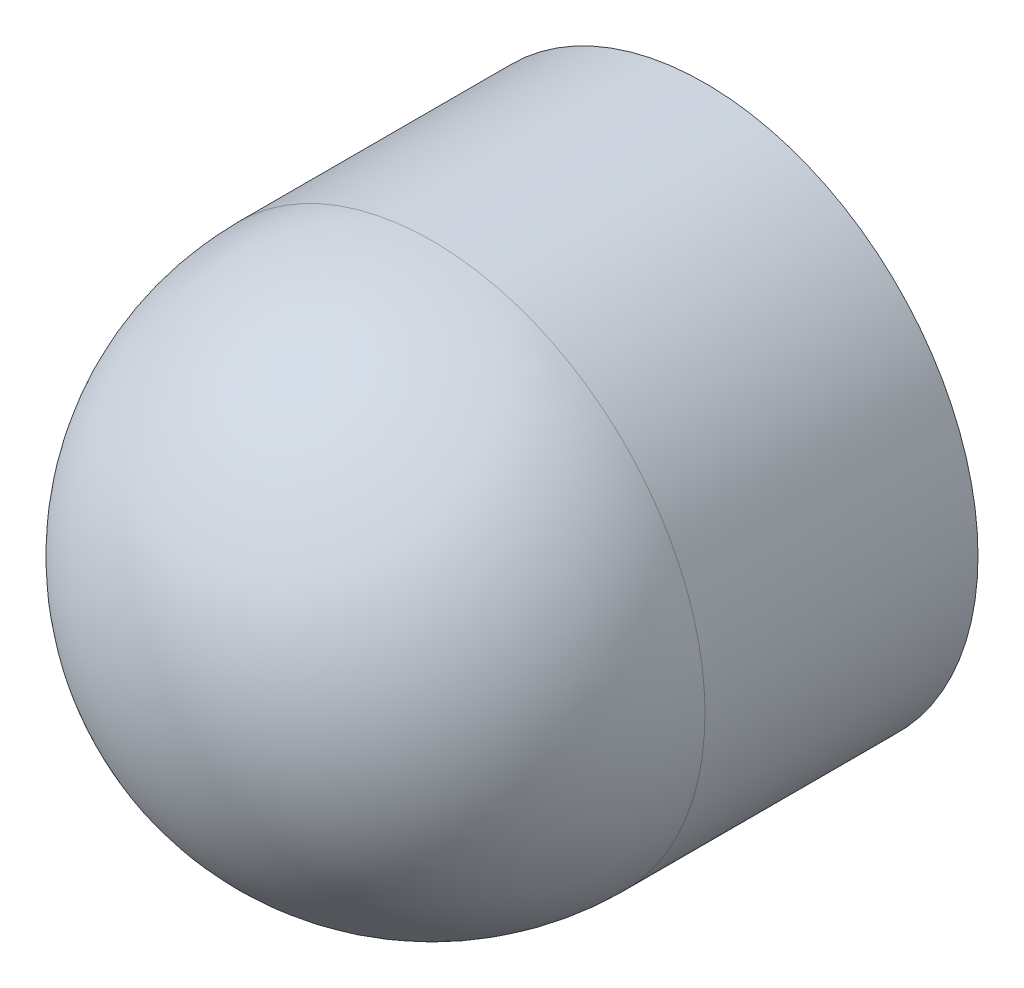
ISO-10303-21;
HEADER;
FILE_DESCRIPTION(('STEP AP214'),'2;1');
FILE_NAME('part.step','',(''),(''),'','','');
FILE_SCHEMA(('AUTOMOTIVE_DESIGN { 1 0 10303 214 1 1 1 1 }'));
ENDSEC;
DATA;
#1=APPLICATION_CONTEXT('core data for automotive mechanical design processes');
#2=APPLICATION_PROTOCOL_DEFINITION('international standard','automotive_design',2000,#1);
#3=PRODUCT_CONTEXT('',#1,'mechanical');
#4=PRODUCT('Part','Part','',(#3));
#5=PRODUCT_RELATED_PRODUCT_CATEGORY('part','',(#4));
#6=PRODUCT_DEFINITION_FORMATION('','',#4);
#7=PRODUCT_DEFINITION_CONTEXT('part definition',#1,'design');
#8=PRODUCT_DEFINITION('design','',#6,#7);
#9=PRODUCT_DEFINITION_SHAPE('','',#8);
#10=(LENGTH_UNIT() NAMED_UNIT(*) SI_UNIT(.MILLI.,.METRE.));
#11=(NAMED_UNIT(*) PLANE_ANGLE_UNIT() SI_UNIT($,.RADIAN.));
#12=(NAMED_UNIT(*) SI_UNIT($,.STERADIAN.) SOLID_ANGLE_UNIT());
#13=UNCERTAINTY_MEASURE_WITH_UNIT(LENGTH_MEASURE(1.E-05),#10,'distance_accuracy_value','');
#14=(GEOMETRIC_REPRESENTATION_CONTEXT(3) GLOBAL_UNCERTAINTY_ASSIGNED_CONTEXT((#13)) GLOBAL_UNIT_ASSIGNED_CONTEXT((#10,
#11,#12)) REPRESENTATION_CONTEXT('',''));
#15=CARTESIAN_POINT('',(0.,0.,0.));
#16=DIRECTION('',(0.,0.,1.));
#17=DIRECTION('',(1.,0.,0.));
#18=AXIS2_PLACEMENT_3D('',#15,#16,#17);
#19=CARTESIAN_POINT('',(0.,0.,10.));
#20=DIRECTION('',(0.,0.,-1.));
#21=DIRECTION('',(-1.,0.,0.));
#22=AXIS2_PLACEMENT_3D('',#19,#20,#21);
#23=CYLINDRICAL_SURFACE('',#22,10.);
#24=CARTESIAN_POINT('',(0.,0.,10.));
#25=DIRECTION('',(0.,0.,1.));
#26=DIRECTION('',(1.,0.,0.));
#27=AXIS2_PLACEMENT_3D('',#24,#25,#26);
#28=CIRCLE('',#27,10.);
#29=CARTESIAN_POINT('',(10.,0.,10.));
#30=VERTEX_POINT('',#29);
#31=EDGE_CURVE('E10',#30,#30,#28,.T.);
#32=ORIENTED_EDGE('',*,*,#31,.F.);
#33=EDGE_LOOP('',(#32));
#34=FACE_BOUND('',#33,.T.);
#35=CARTESIAN_POINT('',(0.,0.,0.));
#36=DIRECTION('',(0.,0.,1.));
#37=DIRECTION('',(1.,0.,0.));
#38=AXIS2_PLACEMENT_3D('',#35,#36,#37);
#39=CIRCLE('',#38,10.);
#40=CARTESIAN_POINT('',(10.,0.,0.));
#41=VERTEX_POINT('',#40);
#42=EDGE_CURVE('E37',#41,#41,#39,.T.);
#43=ORIENTED_EDGE('',*,*,#42,.T.);
#44=EDGE_LOOP('',(#43));
#45=FACE_BOUND('',#44,.T.);
#46=ADVANCED_FACE('F30',(#34,#45),#23,.T.);
#47=CARTESIAN_POINT('',(0.,0.,10.));
#48=DIRECTION('',(0.,0.,1.));
#49=DIRECTION('',(1.,0.,0.));
#50=AXIS2_PLACEMENT_3D('',#47,#48,#49);
#51=SPHERICAL_SURFACE('',#50,10.);
#52=ORIENTED_EDGE('',*,*,#31,.T.);
#53=EDGE_LOOP('',(#52));
#54=FACE_BOUND('',#53,.T.);
#55=ADVANCED_FACE('F32',(#54),#51,.T.);
#56=CARTESIAN_POINT('',(0.,0.,0.));
#57=DIRECTION('',(0.,0.,1.));
#58=DIRECTION('',(1.,0.,0.));
#59=AXIS2_PLACEMENT_3D('',#56,#57,#58);
#60=PLANE('',#59);
#61=CARTESIAN_POINT('',(0.,0.,0.));
#62=DIRECTION('',(0.,0.,-1.));
#63=DIRECTION('',(-1.,0.,0.));
#64=AXIS2_PLACEMENT_3D('',#61,#62,#63);
#65=CIRCLE('',#64,2.52);
#66=CARTESIAN_POINT('',(-2.52,0.,0.));
#67=VERTEX_POINT('',#66);
#68=EDGE_CURVE('E45',#67,#67,#65,.T.);
#69=ORIENTED_EDGE('',*,*,#68,.F.);
#70=EDGE_LOOP('',(#69));
#71=FACE_BOUND('',#70,.T.);
#72=ORIENTED_EDGE('',*,*,#42,.F.);
#73=EDGE_LOOP('',(#72));
#74=FACE_BOUND('',#73,.T.);
#75=ADVANCED_FACE('F53',(#71,#74),#60,.F.);
#76=CARTESIAN_POINT('',(0.,0.,10.));
#77=DIRECTION('',(0.,0.,-1.));
#78=DIRECTION('',(-1.,0.,0.));
#79=AXIS2_PLACEMENT_3D('',#76,#77,#78);
#80=CYLINDRICAL_SURFACE('',#79,2.52);
#81=CARTESIAN_POINT('',(0.,0.,10.));
#82=DIRECTION('',(0.,0.,-1.));
#83=DIRECTION('',(-1.,0.,0.));
#84=AXIS2_PLACEMENT_3D('',#81,#82,#83);
#85=CIRCLE('',#84,2.52);
#86=CARTESIAN_POINT('',(-2.52,0.,10.));
#87=VERTEX_POINT('',#86);
#88=EDGE_CURVE('E41',#87,#87,#85,.T.);
#89=ORIENTED_EDGE('',*,*,#88,.F.);
#90=EDGE_LOOP('',(#89));
#91=FACE_BOUND('',#90,.T.);
#92=ORIENTED_EDGE('',*,*,#68,.T.);
#93=EDGE_LOOP('',(#92));
#94=FACE_BOUND('',#93,.T.);
#95=ADVANCED_FACE('F51',(#91,#94),#80,.F.);
#96=CARTESIAN_POINT('',(0.,0.,10.));
#97=DIRECTION('',(0.,0.,-1.));
#98=DIRECTION('',(-1.,0.,0.));
#99=AXIS2_PLACEMENT_3D('',#96,#97,#98);
#100=PLANE('',#99);
#101=ORIENTED_EDGE('',*,*,#88,.T.);
#102=EDGE_LOOP('',(#101));
#103=FACE_BOUND('',#102,.T.);
#104=ADVANCED_FACE('F61',(#103),#100,.T.);
#105=CLOSED_SHELL('',(#46,#55,#75,#95,#104));
#106=MANIFOLD_SOLID_BREP('B2',#105);
#107=ADVANCED_BREP_SHAPE_REPRESENTATION('',(#18,#106),#14);
#108=SHAPE_DEFINITION_REPRESENTATION(#9,#107);
ENDSEC;
END-ISO-10303-21;
